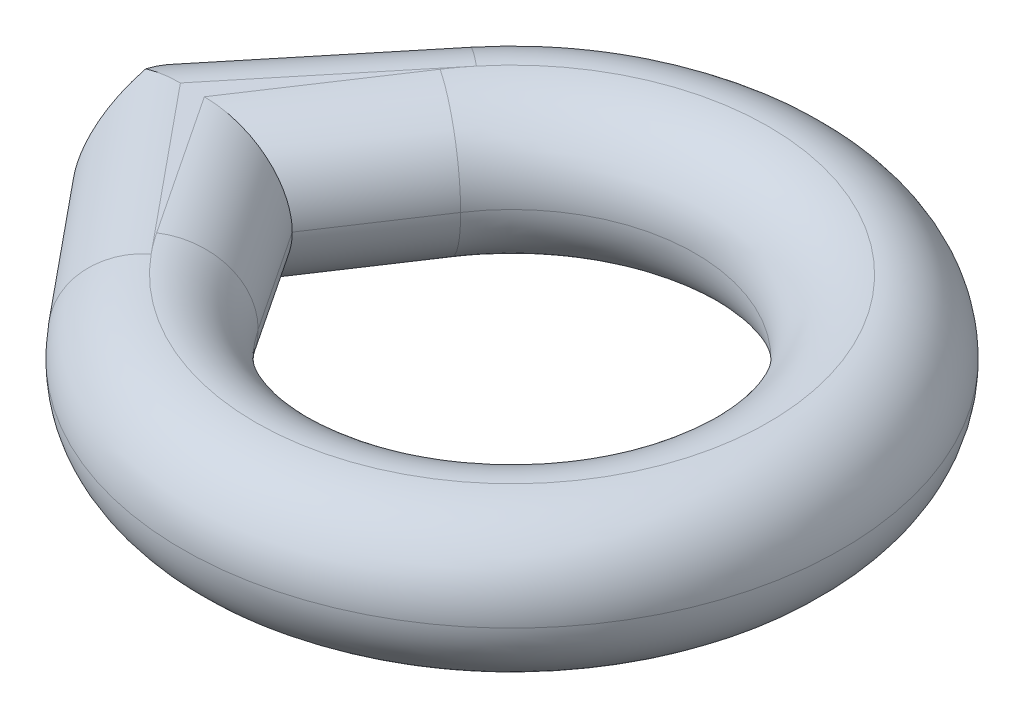
ISO-10303-21;
HEADER;
FILE_DESCRIPTION(('STEP AP214'),'2;1');
FILE_NAME('part.step','',(''),(''),'','','');
FILE_SCHEMA(('AUTOMOTIVE_DESIGN { 1 0 10303 214 1 1 1 1 }'));
ENDSEC;
DATA;
#1=APPLICATION_CONTEXT('core data for automotive mechanical design processes');
#2=APPLICATION_PROTOCOL_DEFINITION('international standard','automotive_design',2000,#1);
#3=PRODUCT_CONTEXT('',#1,'mechanical');
#4=PRODUCT('Part','Part','',(#3));
#5=PRODUCT_RELATED_PRODUCT_CATEGORY('part','',(#4));
#6=PRODUCT_DEFINITION_FORMATION('','',#4);
#7=PRODUCT_DEFINITION_CONTEXT('part definition',#1,'design');
#8=PRODUCT_DEFINITION('design','',#6,#7);
#9=PRODUCT_DEFINITION_SHAPE('','',#8);
#10=(LENGTH_UNIT() NAMED_UNIT(*) SI_UNIT(.MILLI.,.METRE.));
#11=(NAMED_UNIT(*) PLANE_ANGLE_UNIT() SI_UNIT($,.RADIAN.));
#12=(NAMED_UNIT(*) SI_UNIT($,.STERADIAN.) SOLID_ANGLE_UNIT());
#13=UNCERTAINTY_MEASURE_WITH_UNIT(LENGTH_MEASURE(1.E-05),#10,'distance_accuracy_value','');
#14=(GEOMETRIC_REPRESENTATION_CONTEXT(3) GLOBAL_UNCERTAINTY_ASSIGNED_CONTEXT((#13)) GLOBAL_UNIT_ASSIGNED_CONTEXT((#10,
#11,#12)) REPRESENTATION_CONTEXT('',''));
#15=CARTESIAN_POINT('',(0.,0.,0.));
#16=DIRECTION('',(0.,0.,1.));
#17=DIRECTION('',(1.,0.,0.));
#18=AXIS2_PLACEMENT_3D('',#15,#16,#17);
#19=CARTESIAN_POINT('',(-5.,-1.,0.));
#20=DIRECTION('',(1.,0.,0.));
#21=DIRECTION('',(0.,0.,-1.));
#22=AXIS2_PLACEMENT_3D('',#19,#20,#21);
#23=PLANE('',#22);
#24=CARTESIAN_POINT('',(-5.,0.,-0.576753433322483));
#25=DIRECTION('',(1.,0.,0.));
#26=DIRECTION('',(0.,0.,1.));
#27=AXIS2_PLACEMENT_3D('',#24,#25,#26);
#28=ELLIPSE('',#27,1.57675343332248,1.);
#29=CARTESIAN_POINT('',(-5.,0.,1.));
#30=VERTEX_POINT('',#29);
#31=CARTESIAN_POINT('',(-5.,0.930699209664431,0.));
#32=VERTEX_POINT('',#31);
#33=EDGE_CURVE('E202',#30,#32,#28,.F.);
#34=ORIENTED_EDGE('',*,*,#33,.T.);
#35=CARTESIAN_POINT('',(-5.,0.,0.576753433322485));
#36=DIRECTION('',(1.,0.,0.));
#37=DIRECTION('',(0.,0.,1.));
#38=AXIS2_PLACEMENT_3D('',#35,#36,#37);
#39=ELLIPSE('',#38,1.57675343332248,1.);
#40=CARTESIAN_POINT('',(-5.,0.,-1.));
#41=VERTEX_POINT('',#40);
#42=EDGE_CURVE('E208',#32,#41,#39,.F.);
#43=ORIENTED_EDGE('',*,*,#42,.T.);
#44=CARTESIAN_POINT('',(-5.,0.,0.576753433322486));
#45=DIRECTION('',(1.,0.,0.));
#46=DIRECTION('',(0.,0.,-1.));
#47=AXIS2_PLACEMENT_3D('',#44,#45,#46);
#48=ELLIPSE('',#47,1.57675343332248,1.);
#49=CARTESIAN_POINT('',(-5.,-0.93069920966443,0.));
#50=VERTEX_POINT('',#49);
#51=EDGE_CURVE('E206',#41,#50,#48,.F.);
#52=ORIENTED_EDGE('',*,*,#51,.T.);
#53=CARTESIAN_POINT('',(-5.,0.,-0.576753433322484));
#54=DIRECTION('',(1.,0.,0.));
#55=DIRECTION('',(0.,0.,-1.));
#56=AXIS2_PLACEMENT_3D('',#53,#54,#55);
#57=ELLIPSE('',#56,1.57675343332248,1.);
#58=EDGE_CURVE('E204',#50,#30,#57,.F.);
#59=ORIENTED_EDGE('',*,*,#58,.T.);
#60=EDGE_LOOP('',(#34,#43,#52,#59));
#61=FACE_BOUND('',#60,.T.);
#62=ADVANCED_FACE('F34',(#61),#23,.F.);
#63=CARTESIAN_POINT('',(0.,-1.,0.));
#64=DIRECTION('',(0.,1.,0.));
#65=DIRECTION('',(0.,0.,1.));
#66=AXIS2_PLACEMENT_3D('',#63,#64,#65);
#67=PLANE('',#66);
#68=CARTESIAN_POINT('',(0.,-1.,0.));
#69=DIRECTION('',(0.,1.,0.));
#70=DIRECTION('',(0.,0.,1.));
#71=AXIS2_PLACEMENT_3D('',#68,#69,#70);
#72=CIRCLE('',#71,3.5);
#73=CARTESIAN_POINT('',(-2.91666666666667,-1.,1.93469779437398));
#74=VERTEX_POINT('',#73);
#75=CARTESIAN_POINT('',(-2.70604980131549,-1.,2.21975099342255));
#76=VERTEX_POINT('',#75);
#77=EDGE_CURVE('E44',#74,#76,#72,.T.);
#78=ORIENTED_EDGE('',*,*,#77,.T.);
#79=DIRECTION('',(0.6342145695493,0.,0.77315708609014));
#80=VECTOR('',#79,1.);
#81=CARTESIAN_POINT('',(-4.22684291390986,-1.,0.3657854304507));
#82=LINE('',#81,#80);
#83=CARTESIAN_POINT('',(-4.52689377484661,-1.,0.));
#84=VERTEX_POINT('',#83);
#85=EDGE_CURVE('E11',#76,#84,#82,.F.);
#86=ORIENTED_EDGE('',*,*,#85,.T.);
#87=DIRECTION('',(0.6342145695493,0.,-0.77315708609014));
#88=VECTOR('',#87,1.);
#89=CARTESIAN_POINT('',(-2.70604980131549,-1.,-2.21975099342255));
#90=LINE('',#89,#88);
#91=CARTESIAN_POINT('',(-2.70604980131549,-1.,-2.21975099342255));
#92=VERTEX_POINT('',#91);
#93=EDGE_CURVE('E122',#84,#92,#90,.T.);
#94=ORIENTED_EDGE('',*,*,#93,.T.);
#95=CARTESIAN_POINT('',(0.,-1.,0.));
#96=DIRECTION('',(0.,1.,0.));
#97=DIRECTION('',(0.,0.,1.));
#98=AXIS2_PLACEMENT_3D('',#95,#96,#97);
#99=CIRCLE('',#98,3.5);
#100=CARTESIAN_POINT('',(-2.91666666666667,-1.,-1.93469779437398));
#101=VERTEX_POINT('',#100);
#102=EDGE_CURVE('E123',#92,#101,#99,.T.);
#103=ORIENTED_EDGE('',*,*,#102,.T.);
#104=DIRECTION('',(0.552770798392567,0.,-0.833333333333333));
#105=VECTOR('',#104,1.);
#106=CARTESIAN_POINT('',(-3.83333333333333,-1.,-0.552770798392567));
#107=LINE('',#106,#105);
#108=CARTESIAN_POINT('',(-4.2,-1.,0.));
#109=VERTEX_POINT('',#108);
#110=EDGE_CURVE('E121',#101,#109,#107,.F.);
#111=ORIENTED_EDGE('',*,*,#110,.T.);
#112=DIRECTION('',(0.552770798392567,0.,0.833333333333333));
#113=VECTOR('',#112,1.);
#114=CARTESIAN_POINT('',(-2.91666666666667,-1.,1.93469779437398));
#115=LINE('',#114,#113);
#116=EDGE_CURVE('E118',#109,#74,#115,.T.);
#117=ORIENTED_EDGE('',*,*,#116,.T.);
#118=EDGE_LOOP('',(#78,#86,#94,#103,#111,#117));
#119=FACE_BOUND('',#118,.T.);
#120=ADVANCED_FACE('F119',(#119),#67,.F.);
#121=CARTESIAN_POINT('',(0.,1.,0.));
#122=DIRECTION('',(0.,1.,0.));
#123=DIRECTION('',(0.,0.,1.));
#124=AXIS2_PLACEMENT_3D('',#121,#122,#123);
#125=PLANE('',#124);
#126=DIRECTION('',(0.6342145695493,0.,-0.77315708609014));
#127=VECTOR('',#126,1.);
#128=CARTESIAN_POINT('',(-4.22684291390986,1.,-0.3657854304507));
#129=LINE('',#128,#127);
#130=CARTESIAN_POINT('',(-2.70604980131549,1.,-2.21975099342255));
#131=VERTEX_POINT('',#130);
#132=CARTESIAN_POINT('',(-4.52689377484661,1.,0.));
#133=VERTEX_POINT('',#132);
#134=EDGE_CURVE('E197',#131,#133,#129,.F.);
#135=ORIENTED_EDGE('',*,*,#134,.T.);
#136=DIRECTION('',(0.6342145695493,0.,0.77315708609014));
#137=VECTOR('',#136,1.);
#138=CARTESIAN_POINT('',(-2.70604980131549,1.,2.21975099342255));
#139=LINE('',#138,#137);
#140=CARTESIAN_POINT('',(-2.70604980131549,1.,2.21975099342255));
#141=VERTEX_POINT('',#140);
#142=EDGE_CURVE('E200',#133,#141,#139,.T.);
#143=ORIENTED_EDGE('',*,*,#142,.T.);
#144=CARTESIAN_POINT('',(0.,1.,0.));
#145=DIRECTION('',(0.,1.,0.));
#146=DIRECTION('',(0.,0.,1.));
#147=AXIS2_PLACEMENT_3D('',#144,#145,#146);
#148=CIRCLE('',#147,3.5);
#149=CARTESIAN_POINT('',(-2.91666666666667,1.,1.93469779437398));
#150=VERTEX_POINT('',#149);
#151=EDGE_CURVE('E191',#141,#150,#148,.F.);
#152=ORIENTED_EDGE('',*,*,#151,.T.);
#153=DIRECTION('',(0.552770798392567,0.,0.833333333333333));
#154=VECTOR('',#153,1.);
#155=CARTESIAN_POINT('',(-3.83333333333333,1.,0.552770798392567));
#156=LINE('',#155,#154);
#157=CARTESIAN_POINT('',(-4.2,1.,0.));
#158=VERTEX_POINT('',#157);
#159=EDGE_CURVE('E83',#150,#158,#156,.F.);
#160=ORIENTED_EDGE('',*,*,#159,.T.);
#161=DIRECTION('',(0.552770798392567,0.,-0.833333333333333));
#162=VECTOR('',#161,1.);
#163=CARTESIAN_POINT('',(-2.91666666666667,1.,-1.93469779437398));
#164=LINE('',#163,#162);
#165=CARTESIAN_POINT('',(-2.91666666666667,1.,-1.93469779437398));
#166=VERTEX_POINT('',#165);
#167=EDGE_CURVE('E186',#158,#166,#164,.T.);
#168=ORIENTED_EDGE('',*,*,#167,.T.);
#169=CARTESIAN_POINT('',(0.,1.,0.));
#170=DIRECTION('',(0.,1.,0.));
#171=DIRECTION('',(0.,0.,1.));
#172=AXIS2_PLACEMENT_3D('',#169,#170,#171);
#173=CIRCLE('',#172,3.5);
#174=EDGE_CURVE('E195',#166,#131,#173,.F.);
#175=ORIENTED_EDGE('',*,*,#174,.T.);
#176=EDGE_LOOP('',(#135,#143,#152,#160,#168,#175));
#177=FACE_BOUND('',#176,.T.);
#178=ADVANCED_FACE('F239',(#177),#125,.T.);
#179=CARTESIAN_POINT('',(-2.91666666666667,0.,1.93469779437398));
#180=DIRECTION('',(0.552770798392567,0.,0.833333333333333));
#181=DIRECTION('',(0.833333333333333,0.,-0.552770798392567));
#182=AXIS2_PLACEMENT_3D('',#179,#180,#181);
#183=CYLINDRICAL_SURFACE('',#182,1.);
#184=CARTESIAN_POINT('',(-2.91666666666667,0.,1.93469779437398));
#185=DIRECTION('',(0.552770798392567,0.,0.833333333333333));
#186=DIRECTION('',(0.833333333333333,0.,-0.552770798392567));
#187=AXIS2_PLACEMENT_3D('',#184,#185,#186);
#188=CIRCLE('',#187,1.);
#189=CARTESIAN_POINT('',(-2.08333333333333,0.,1.38192699598142));
#190=VERTEX_POINT('',#189);
#191=EDGE_CURVE('E125',#74,#190,#188,.T.);
#192=ORIENTED_EDGE('',*,*,#191,.F.);
#193=ORIENTED_EDGE('',*,*,#116,.F.);
#194=CARTESIAN_POINT('',(-4.2,0.,0.));
#195=DIRECTION('',(0.,0.,1.));
#196=DIRECTION('',(1.,0.,0.));
#197=AXIS2_PLACEMENT_3D('',#194,#195,#196);
#198=ELLIPSE('',#197,1.2,1.);
#199=CARTESIAN_POINT('',(-3.,0.,0.));
#200=VERTEX_POINT('',#199);
#201=EDGE_CURVE('E38',#200,#109,#198,.F.);
#202=ORIENTED_EDGE('',*,*,#201,.F.);
#203=DIRECTION('',(0.552770798392567,0.,0.833333333333333));
#204=VECTOR('',#203,1.);
#205=CARTESIAN_POINT('',(-2.08333333333333,0.,1.38192699598142));
#206=LINE('',#205,#204);
#207=EDGE_CURVE('E71',#190,#200,#206,.F.);
#208=ORIENTED_EDGE('',*,*,#207,.F.);
#209=EDGE_LOOP('',(#192,#193,#202,#208));
#210=FACE_BOUND('',#209,.T.);
#211=ADVANCED_FACE('F36',(#210),#183,.T.);
#212=CARTESIAN_POINT('',(-2.91666666666667,0.,-1.93469779437398));
#213=DIRECTION('',(-0.552770798392567,0.,0.833333333333333));
#214=DIRECTION('',(0.833333333333333,0.,0.552770798392567));
#215=AXIS2_PLACEMENT_3D('',#212,#213,#214);
#216=CYLINDRICAL_SURFACE('',#215,1.);
#217=ORIENTED_EDGE('',*,*,#201,.T.);
#218=ORIENTED_EDGE('',*,*,#110,.F.);
#219=CARTESIAN_POINT('',(-2.91666666666667,0.,-1.93469779437398));
#220=DIRECTION('',(0.552770798392567,0.,-0.833333333333333));
#221=DIRECTION('',(-0.833333333333333,0.,-0.552770798392567));
#222=AXIS2_PLACEMENT_3D('',#219,#220,#221);
#223=CIRCLE('',#222,1.);
#224=CARTESIAN_POINT('',(-2.08333333333333,0.,-1.38192699598142));
#225=VERTEX_POINT('',#224);
#226=EDGE_CURVE('E129',#225,#101,#223,.T.);
#227=ORIENTED_EDGE('',*,*,#226,.F.);
#228=DIRECTION('',(0.552770798392567,0.,-0.833333333333333));
#229=VECTOR('',#228,1.);
#230=CARTESIAN_POINT('',(-2.08333333333333,0.,-1.38192699598142));
#231=LINE('',#230,#229);
#232=EDGE_CURVE('E180',#200,#225,#231,.T.);
#233=ORIENTED_EDGE('',*,*,#232,.F.);
#234=EDGE_LOOP('',(#217,#218,#227,#233));
#235=FACE_BOUND('',#234,.T.);
#236=ADVANCED_FACE('F213',(#235),#216,.T.);
#237=CARTESIAN_POINT('',(-2.91666666666667,0.,1.93469779437398));
#238=DIRECTION('',(-0.552770798392567,0.,-0.833333333333333));
#239=DIRECTION('',(-0.833333333333333,0.,0.552770798392567));
#240=AXIS2_PLACEMENT_3D('',#237,#238,#239);
#241=CYLINDRICAL_SURFACE('',#240,1.);
#242=CARTESIAN_POINT('',(-2.91666666666667,0.,1.93469779437398));
#243=DIRECTION('',(0.552770798392567,0.,0.833333333333333));
#244=DIRECTION('',(0.833333333333333,0.,-0.552770798392567));
#245=AXIS2_PLACEMENT_3D('',#242,#243,#244);
#246=CIRCLE('',#245,1.);
#247=EDGE_CURVE('E171',#190,#150,#246,.T.);
#248=ORIENTED_EDGE('',*,*,#247,.F.);
#249=ORIENTED_EDGE('',*,*,#207,.T.);
#250=CARTESIAN_POINT('',(-4.2,0.,0.));
#251=DIRECTION('',(0.,0.,-1.));
#252=DIRECTION('',(-1.,0.,0.));
#253=AXIS2_PLACEMENT_3D('',#250,#251,#252);
#254=ELLIPSE('',#253,1.2,1.);
#255=EDGE_CURVE('E177',#158,#200,#254,.T.);
#256=ORIENTED_EDGE('',*,*,#255,.F.);
#257=ORIENTED_EDGE('',*,*,#159,.F.);
#258=EDGE_LOOP('',(#248,#249,#256,#257));
#259=FACE_BOUND('',#258,.T.);
#260=ADVANCED_FACE('F220',(#259),#241,.T.);
#261=CARTESIAN_POINT('',(0.,0.,0.));
#262=DIRECTION('',(0.,1.,0.));
#263=DIRECTION('',(0.,0.,1.));
#264=AXIS2_PLACEMENT_3D('',#261,#262,#263);
#265=TOROIDAL_SURFACE('',#264,3.5,1.);
#266=ORIENTED_EDGE('',*,*,#77,.F.);
#267=ORIENTED_EDGE('',*,*,#191,.T.);
#268=CARTESIAN_POINT('',(0.,0.,0.));
#269=DIRECTION('',(0.,1.,0.));
#270=DIRECTION('',(0.,0.,1.));
#271=AXIS2_PLACEMENT_3D('',#268,#269,#270);
#272=CIRCLE('',#271,2.5);
#273=EDGE_CURVE('E168',#225,#190,#272,.F.);
#274=ORIENTED_EDGE('',*,*,#273,.F.);
#275=ORIENTED_EDGE('',*,*,#226,.T.);
#276=ORIENTED_EDGE('',*,*,#102,.F.);
#277=CARTESIAN_POINT('',(0.,-1.,0.));
#278=DIRECTION('',(0.,1.,0.));
#279=DIRECTION('',(0.,0.,1.));
#280=AXIS2_PLACEMENT_3D('',#277,#278,#279);
#281=CIRCLE('',#280,3.5);
#282=EDGE_CURVE('E135',#76,#92,#281,.T.);
#283=ORIENTED_EDGE('',*,*,#282,.F.);
#284=EDGE_LOOP('',(#266,#267,#274,#275,#276,#283));
#285=FACE_BOUND('',#284,.T.);
#286=ADVANCED_FACE('F132',(#285),#265,.T.);
#287=CARTESIAN_POINT('',(-2.70604980131549,0.,2.21975099342255));
#288=DIRECTION('',(-0.6342145695493,0.,-0.77315708609014));
#289=DIRECTION('',(-0.77315708609014,0.,0.6342145695493));
#290=AXIS2_PLACEMENT_3D('',#287,#288,#289);
#291=CYLINDRICAL_SURFACE('',#290,1.);
#292=CARTESIAN_POINT('',(-4.52689377484661,0.,0.));
#293=DIRECTION('',(0.,0.,-1.));
#294=DIRECTION('',(1.,0.,0.));
#295=AXIS2_PLACEMENT_3D('',#292,#293,#294);
#296=ELLIPSE('',#295,1.29339822138475,1.);
#297=EDGE_CURVE('E159',#84,#50,#296,.T.);
#298=ORIENTED_EDGE('',*,*,#297,.F.);
#299=ORIENTED_EDGE('',*,*,#85,.F.);
#300=CARTESIAN_POINT('',(-2.70604980131549,0.,2.21975099342255));
#301=DIRECTION('',(0.6342145695493,0.,0.77315708609014));
#302=DIRECTION('',(0.77315708609014,0.,-0.6342145695493));
#303=AXIS2_PLACEMENT_3D('',#300,#301,#302);
#304=CIRCLE('',#303,1.);
#305=CARTESIAN_POINT('',(-3.47920688740563,0.,2.85396556297185));
#306=VERTEX_POINT('',#305);
#307=EDGE_CURVE('E174',#306,#76,#304,.T.);
#308=ORIENTED_EDGE('',*,*,#307,.F.);
#309=DIRECTION('',(0.6342145695493,0.,0.77315708609014));
#310=VECTOR('',#309,1.);
#311=CARTESIAN_POINT('',(-3.47920688740563,0.,2.85396556297185));
#312=LINE('',#311,#310);
#313=EDGE_CURVE('E162',#30,#306,#312,.T.);
#314=ORIENTED_EDGE('',*,*,#313,.F.);
#315=ORIENTED_EDGE('',*,*,#58,.F.);
#316=EDGE_LOOP('',(#298,#299,#308,#314,#315));
#317=FACE_BOUND('',#316,.T.);
#318=ADVANCED_FACE('F269',(#317),#291,.T.);
#319=CARTESIAN_POINT('',(-2.91666666666667,0.,-1.93469779437398));
#320=DIRECTION('',(0.552770798392567,0.,-0.833333333333333));
#321=DIRECTION('',(-0.833333333333333,0.,-0.552770798392567));
#322=AXIS2_PLACEMENT_3D('',#319,#320,#321);
#323=CYLINDRICAL_SURFACE('',#322,1.);
#324=ORIENTED_EDGE('',*,*,#255,.T.);
#325=ORIENTED_EDGE('',*,*,#232,.T.);
#326=CARTESIAN_POINT('',(-2.91666666666667,0.,-1.93469779437398));
#327=DIRECTION('',(0.552770798392566,0.,-0.833333333333333));
#328=DIRECTION('',(-0.833333333333333,0.,-0.552770798392566));
#329=AXIS2_PLACEMENT_3D('',#326,#327,#328);
#330=CIRCLE('',#329,1.);
#331=EDGE_CURVE('E165',#166,#225,#330,.T.);
#332=ORIENTED_EDGE('',*,*,#331,.F.);
#333=ORIENTED_EDGE('',*,*,#167,.F.);
#334=EDGE_LOOP('',(#324,#325,#332,#333));
#335=FACE_BOUND('',#334,.T.);
#336=ADVANCED_FACE('F219',(#335),#323,.T.);
#337=CARTESIAN_POINT('',(0.,0.,0.));
#338=DIRECTION('',(0.,1.,0.));
#339=DIRECTION('',(0.,0.,1.));
#340=AXIS2_PLACEMENT_3D('',#337,#338,#339);
#341=TOROIDAL_SURFACE('',#340,3.5,1.);
#342=ORIENTED_EDGE('',*,*,#247,.T.);
#343=ORIENTED_EDGE('',*,*,#151,.F.);
#344=CARTESIAN_POINT('',(0.,1.,0.));
#345=DIRECTION('',(0.,1.,0.));
#346=DIRECTION('',(0.,0.,1.));
#347=AXIS2_PLACEMENT_3D('',#344,#345,#346);
#348=CIRCLE('',#347,3.5);
#349=EDGE_CURVE('E148',#131,#141,#348,.F.);
#350=ORIENTED_EDGE('',*,*,#349,.F.);
#351=ORIENTED_EDGE('',*,*,#174,.F.);
#352=ORIENTED_EDGE('',*,*,#331,.T.);
#353=ORIENTED_EDGE('',*,*,#273,.T.);
#354=EDGE_LOOP('',(#342,#343,#350,#351,#352,#353));
#355=FACE_BOUND('',#354,.T.);
#356=ADVANCED_FACE('F216',(#355),#341,.T.);
#357=CARTESIAN_POINT('',(0.,0.,0.));
#358=DIRECTION('',(0.,1.,0.));
#359=DIRECTION('',(0.,0.,1.));
#360=AXIS2_PLACEMENT_3D('',#357,#358,#359);
#361=TOROIDAL_SURFACE('',#360,3.5,1.);
#362=ORIENTED_EDGE('',*,*,#307,.T.);
#363=ORIENTED_EDGE('',*,*,#282,.T.);
#364=CARTESIAN_POINT('',(-2.70604980131549,0.,-2.21975099342255));
#365=DIRECTION('',(-0.6342145695493,0.,0.77315708609014));
#366=DIRECTION('',(0.77315708609014,0.,0.6342145695493));
#367=AXIS2_PLACEMENT_3D('',#364,#365,#366);
#368=CIRCLE('',#367,1.);
#369=CARTESIAN_POINT('',(-3.47920688740563,0.,-2.85396556297185));
#370=VERTEX_POINT('',#369);
#371=EDGE_CURVE('E157',#370,#92,#368,.T.);
#372=ORIENTED_EDGE('',*,*,#371,.F.);
#373=CARTESIAN_POINT('',(0.,0.,0.));
#374=DIRECTION('',(0.,1.,0.));
#375=DIRECTION('',(0.,0.,1.));
#376=AXIS2_PLACEMENT_3D('',#373,#374,#375);
#377=CIRCLE('',#376,4.5);
#378=EDGE_CURVE('E154',#306,#370,#377,.T.);
#379=ORIENTED_EDGE('',*,*,#378,.F.);
#380=EDGE_LOOP('',(#362,#363,#372,#379));
#381=FACE_BOUND('',#380,.T.);
#382=ADVANCED_FACE('F263',(#381),#361,.T.);
#383=CARTESIAN_POINT('',(-2.70604980131549,0.,2.21975099342255));
#384=DIRECTION('',(0.6342145695493,0.,0.77315708609014));
#385=DIRECTION('',(0.77315708609014,0.,-0.6342145695493));
#386=AXIS2_PLACEMENT_3D('',#383,#384,#385);
#387=CYLINDRICAL_SURFACE('',#386,1.);
#388=ORIENTED_EDGE('',*,*,#33,.F.);
#389=ORIENTED_EDGE('',*,*,#313,.T.);
#390=CARTESIAN_POINT('',(-2.70604980131549,0.,2.21975099342255));
#391=DIRECTION('',(0.6342145695493,0.,0.77315708609014));
#392=DIRECTION('',(0.77315708609014,0.,-0.6342145695493));
#393=AXIS2_PLACEMENT_3D('',#390,#391,#392);
#394=CIRCLE('',#393,1.);
#395=EDGE_CURVE('E151',#141,#306,#394,.T.);
#396=ORIENTED_EDGE('',*,*,#395,.F.);
#397=ORIENTED_EDGE('',*,*,#142,.F.);
#398=CARTESIAN_POINT('',(-4.52689377484661,0.,0.));
#399=DIRECTION('',(0.,0.,1.));
#400=DIRECTION('',(1.,0.,0.));
#401=AXIS2_PLACEMENT_3D('',#398,#399,#400);
#402=ELLIPSE('',#401,1.29339822138475,1.);
#403=EDGE_CURVE('E146',#32,#133,#402,.F.);
#404=ORIENTED_EDGE('',*,*,#403,.F.);
#405=EDGE_LOOP('',(#388,#389,#396,#397,#404));
#406=FACE_BOUND('',#405,.T.);
#407=ADVANCED_FACE('F227',(#406),#387,.T.);
#408=CARTESIAN_POINT('',(-2.70604980131549,0.,-2.21975099342255));
#409=DIRECTION('',(0.6342145695493,0.,-0.77315708609014));
#410=DIRECTION('',(-0.77315708609014,0.,-0.6342145695493));
#411=AXIS2_PLACEMENT_3D('',#408,#409,#410);
#412=CYLINDRICAL_SURFACE('',#411,1.);
#413=ORIENTED_EDGE('',*,*,#297,.T.);
#414=ORIENTED_EDGE('',*,*,#51,.F.);
#415=DIRECTION('',(0.6342145695493,0.,-0.77315708609014));
#416=VECTOR('',#415,1.);
#417=CARTESIAN_POINT('',(-3.47920688740563,0.,-2.85396556297185));
#418=LINE('',#417,#416);
#419=EDGE_CURVE('E144',#370,#41,#418,.F.);
#420=ORIENTED_EDGE('',*,*,#419,.F.);
#421=ORIENTED_EDGE('',*,*,#371,.T.);
#422=ORIENTED_EDGE('',*,*,#93,.F.);
#423=EDGE_LOOP('',(#413,#414,#420,#421,#422));
#424=FACE_BOUND('',#423,.T.);
#425=ADVANCED_FACE('F257',(#424),#412,.T.);
#426=CARTESIAN_POINT('',(0.,0.,0.));
#427=DIRECTION('',(0.,1.,0.));
#428=DIRECTION('',(0.,0.,1.));
#429=AXIS2_PLACEMENT_3D('',#426,#427,#428);
#430=TOROIDAL_SURFACE('',#429,3.5,1.);
#431=ORIENTED_EDGE('',*,*,#395,.T.);
#432=ORIENTED_EDGE('',*,*,#378,.T.);
#433=CARTESIAN_POINT('',(-2.70604980131549,0.,-2.21975099342255));
#434=DIRECTION('',(-0.6342145695493,0.,0.77315708609014));
#435=DIRECTION('',(0.77315708609014,0.,0.6342145695493));
#436=AXIS2_PLACEMENT_3D('',#433,#434,#435);
#437=CIRCLE('',#436,1.);
#438=EDGE_CURVE('E141',#131,#370,#437,.T.);
#439=ORIENTED_EDGE('',*,*,#438,.F.);
#440=ORIENTED_EDGE('',*,*,#349,.T.);
#441=EDGE_LOOP('',(#431,#432,#439,#440));
#442=FACE_BOUND('',#441,.T.);
#443=ADVANCED_FACE('F233',(#442),#430,.T.);
#444=CARTESIAN_POINT('',(-2.70604980131549,0.,-2.21975099342255));
#445=DIRECTION('',(-0.6342145695493,0.,0.77315708609014));
#446=DIRECTION('',(0.77315708609014,0.,0.6342145695493));
#447=AXIS2_PLACEMENT_3D('',#444,#445,#446);
#448=CYLINDRICAL_SURFACE('',#447,1.);
#449=ORIENTED_EDGE('',*,*,#403,.T.);
#450=ORIENTED_EDGE('',*,*,#134,.F.);
#451=ORIENTED_EDGE('',*,*,#438,.T.);
#452=ORIENTED_EDGE('',*,*,#419,.T.);
#453=ORIENTED_EDGE('',*,*,#42,.F.);
#454=EDGE_LOOP('',(#449,#450,#451,#452,#453));
#455=FACE_BOUND('',#454,.T.);
#456=ADVANCED_FACE('F236',(#455),#448,.T.);
#457=CLOSED_SHELL('',(#62,#120,#178,#211,#236,#260,#286,#318,#336,#356,#382,#407,#425,#443,#456));
#458=MANIFOLD_SOLID_BREP('B2',#457);
#459=ADVANCED_BREP_SHAPE_REPRESENTATION('',(#18,#458),#14);
#460=SHAPE_DEFINITION_REPRESENTATION(#9,#459);
ENDSEC;
END-ISO-10303-21;
